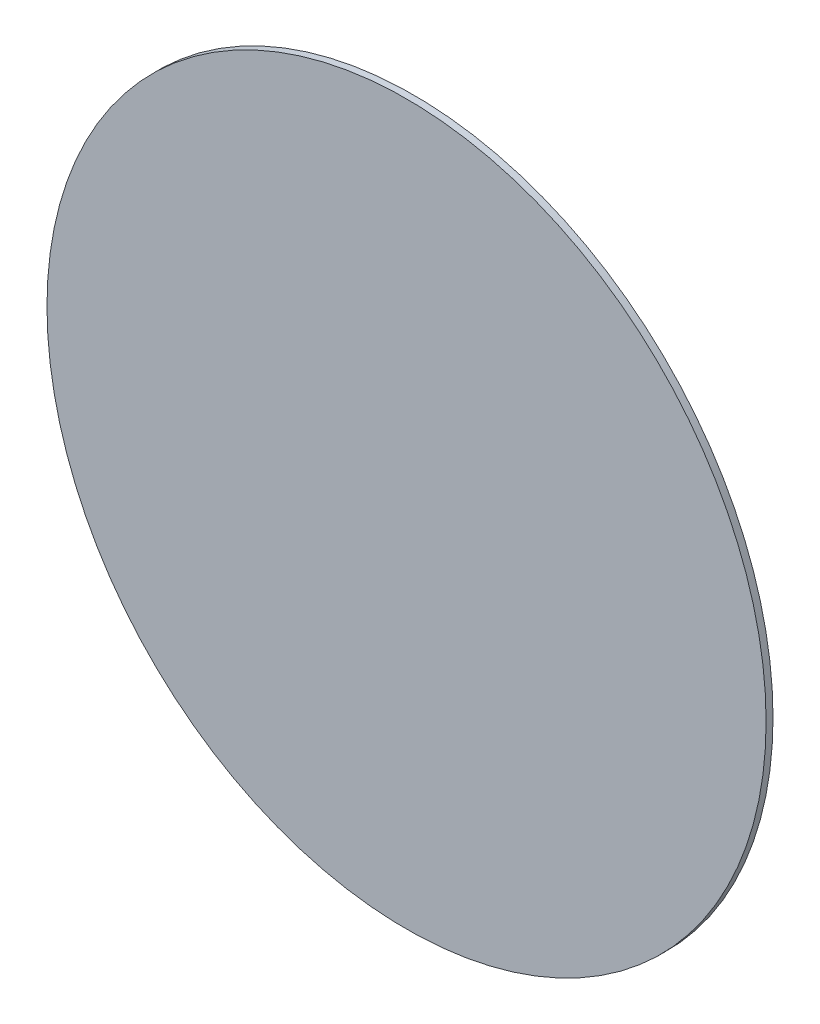
ISO-10303-21;
HEADER;
FILE_DESCRIPTION(('STEP AP214'),'2;1');
FILE_NAME('part.step','',(''),(''),'','','');
FILE_SCHEMA(('AUTOMOTIVE_DESIGN { 1 0 10303 214 1 1 1 1 }'));
ENDSEC;
DATA;
#1=APPLICATION_CONTEXT('core data for automotive mechanical design processes');
#2=APPLICATION_PROTOCOL_DEFINITION('international standard','automotive_design',2000,#1);
#3=PRODUCT_CONTEXT('',#1,'mechanical');
#4=PRODUCT('Part','Part','',(#3));
#5=PRODUCT_RELATED_PRODUCT_CATEGORY('part','',(#4));
#6=PRODUCT_DEFINITION_FORMATION('','',#4);
#7=PRODUCT_DEFINITION_CONTEXT('part definition',#1,'design');
#8=PRODUCT_DEFINITION('design','',#6,#7);
#9=PRODUCT_DEFINITION_SHAPE('','',#8);
#10=(LENGTH_UNIT() NAMED_UNIT(*) SI_UNIT(.MILLI.,.METRE.));
#11=(NAMED_UNIT(*) PLANE_ANGLE_UNIT() SI_UNIT($,.RADIAN.));
#12=(NAMED_UNIT(*) SI_UNIT($,.STERADIAN.) SOLID_ANGLE_UNIT());
#13=UNCERTAINTY_MEASURE_WITH_UNIT(LENGTH_MEASURE(1.E-05),#10,'distance_accuracy_value','');
#14=(GEOMETRIC_REPRESENTATION_CONTEXT(3) GLOBAL_UNCERTAINTY_ASSIGNED_CONTEXT((#13)) GLOBAL_UNIT_ASSIGNED_CONTEXT((#10,
#11,#12)) REPRESENTATION_CONTEXT('',''));
#15=CARTESIAN_POINT('',(0.,0.,0.));
#16=DIRECTION('',(0.,0.,1.));
#17=DIRECTION('',(1.,0.,0.));
#18=AXIS2_PLACEMENT_3D('',#15,#16,#17);
#19=CARTESIAN_POINT('',(0.,0.,0.5));
#20=DIRECTION('',(0.,0.,-1.));
#21=DIRECTION('',(-1.,0.,0.));
#22=AXIS2_PLACEMENT_3D('',#19,#20,#21);
#23=CYLINDRICAL_SURFACE('',#22,26.);
#24=CARTESIAN_POINT('',(0.,0.,0.5));
#25=DIRECTION('',(0.,0.,1.));
#26=DIRECTION('',(1.,0.,0.));
#27=AXIS2_PLACEMENT_3D('',#24,#25,#26);
#28=CIRCLE('',#27,26.);
#29=CARTESIAN_POINT('',(26.,0.,0.5));
#30=VERTEX_POINT('',#29);
#31=EDGE_CURVE('E10',#30,#30,#28,.T.);
#32=ORIENTED_EDGE('',*,*,#31,.F.);
#33=EDGE_LOOP('',(#32));
#34=FACE_BOUND('',#33,.T.);
#35=CARTESIAN_POINT('',(0.,0.,0.));
#36=DIRECTION('',(0.,0.,1.));
#37=DIRECTION('',(1.,0.,0.));
#38=AXIS2_PLACEMENT_3D('',#35,#36,#37);
#39=CIRCLE('',#38,26.);
#40=CARTESIAN_POINT('',(26.,0.,0.));
#41=VERTEX_POINT('',#40);
#42=EDGE_CURVE('E40',#41,#41,#39,.T.);
#43=ORIENTED_EDGE('',*,*,#42,.T.);
#44=EDGE_LOOP('',(#43));
#45=FACE_BOUND('',#44,.T.);
#46=ADVANCED_FACE('F37',(#34,#45),#23,.T.);
#47=CARTESIAN_POINT('',(0.,0.,0.5));
#48=DIRECTION('',(0.,0.,1.));
#49=DIRECTION('',(1.,0.,0.));
#50=AXIS2_PLACEMENT_3D('',#47,#48,#49);
#51=PLANE('',#50);
#52=ORIENTED_EDGE('',*,*,#31,.T.);
#53=EDGE_LOOP('',(#52));
#54=FACE_BOUND('',#53,.T.);
#55=ADVANCED_FACE('F54',(#54),#51,.T.);
#56=CARTESIAN_POINT('',(0.,0.,0.));
#57=DIRECTION('',(0.,0.,1.));
#58=DIRECTION('',(1.,0.,0.));
#59=AXIS2_PLACEMENT_3D('',#56,#57,#58);
#60=PLANE('',#59);
#61=ORIENTED_EDGE('',*,*,#42,.F.);
#62=EDGE_LOOP('',(#61));
#63=FACE_BOUND('',#62,.T.);
#64=ADVANCED_FACE('F52',(#63),#60,.F.);
#65=CLOSED_SHELL('',(#46,#55,#64));
#66=MANIFOLD_SOLID_BREP('B2',#65);
#67=ADVANCED_BREP_SHAPE_REPRESENTATION('',(#18,#66),#14);
#68=SHAPE_DEFINITION_REPRESENTATION(#9,#67);
ENDSEC;
END-ISO-10303-21;
